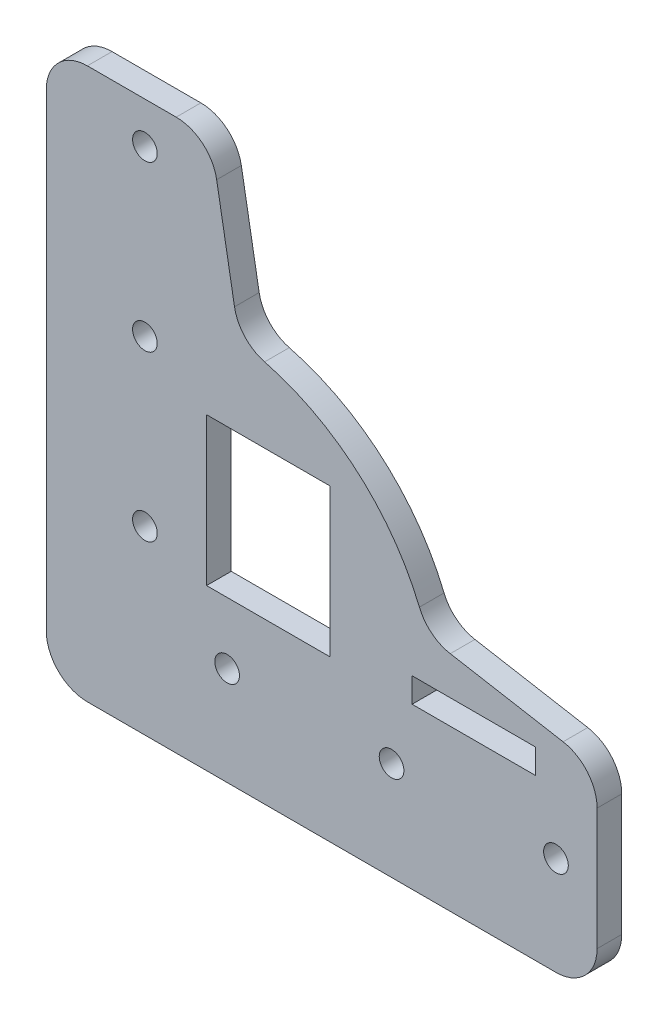
ISO-10303-21;
HEADER;
FILE_DESCRIPTION(('STEP AP214'),'2;1');
FILE_NAME('part.step','',(''),(''),'','','');
FILE_SCHEMA(('AUTOMOTIVE_DESIGN { 1 0 10303 214 1 1 1 1 }'));
ENDSEC;
DATA;
#1=APPLICATION_CONTEXT('core data for automotive mechanical design processes');
#2=APPLICATION_PROTOCOL_DEFINITION('international standard','automotive_design',2000,#1);
#3=PRODUCT_CONTEXT('',#1,'mechanical');
#4=PRODUCT('Part','Part','',(#3));
#5=PRODUCT_RELATED_PRODUCT_CATEGORY('part','',(#4));
#6=PRODUCT_DEFINITION_FORMATION('','',#4);
#7=PRODUCT_DEFINITION_CONTEXT('part definition',#1,'design');
#8=PRODUCT_DEFINITION('design','',#6,#7);
#9=PRODUCT_DEFINITION_SHAPE('','',#8);
#10=(LENGTH_UNIT() NAMED_UNIT(*) SI_UNIT(.MILLI.,.METRE.));
#11=(NAMED_UNIT(*) PLANE_ANGLE_UNIT() SI_UNIT($,.RADIAN.));
#12=(NAMED_UNIT(*) SI_UNIT($,.STERADIAN.) SOLID_ANGLE_UNIT());
#13=UNCERTAINTY_MEASURE_WITH_UNIT(LENGTH_MEASURE(1.E-05),#10,'distance_accuracy_value','');
#14=(GEOMETRIC_REPRESENTATION_CONTEXT(3) GLOBAL_UNCERTAINTY_ASSIGNED_CONTEXT((#13)) GLOBAL_UNIT_ASSIGNED_CONTEXT((#10,
#11,#12)) REPRESENTATION_CONTEXT('',''));
#15=CARTESIAN_POINT('',(0.,0.,0.));
#16=DIRECTION('',(0.,0.,1.));
#17=DIRECTION('',(1.,0.,0.));
#18=AXIS2_PLACEMENT_3D('',#15,#16,#17);
#19=CARTESIAN_POINT('',(27.8219353715967,51.4334525485574,3.));
#20=DIRECTION('',(0.,0.,1.));
#21=DIRECTION('',(1.,0.,0.));
#22=AXIS2_PLACEMENT_3D('',#19,#20,#21);
#23=PLANE('',#22);
#24=CARTESIAN_POINT('',(42.,12.,3.));
#25=DIRECTION('',(0.,0.,1.));
#26=DIRECTION('',(-1.,0.,0.));
#27=AXIS2_PLACEMENT_3D('',#24,#25,#26);
#28=CIRCLE('',#27,1.5);
#29=CARTESIAN_POINT('',(40.5,12.,3.));
#30=VERTEX_POINT('',#29);
#31=EDGE_CURVE('E231',#30,#30,#28,.T.);
#32=ORIENTED_EDGE('',*,*,#31,.F.);
#33=EDGE_LOOP('',(#32));
#34=FACE_BOUND('',#33,.T.);
#35=DIRECTION('',(1.,0.,0.));
#36=VECTOR('',#35,1.);
#37=CARTESIAN_POINT('',(19.5,19.5,3.));
#38=LINE('',#37,#36);
#39=CARTESIAN_POINT('',(19.5,19.5,3.));
#40=VERTEX_POINT('',#39);
#41=CARTESIAN_POINT('',(34.5,19.5,3.));
#42=VERTEX_POINT('',#41);
#43=EDGE_CURVE('E245',#40,#42,#38,.T.);
#44=ORIENTED_EDGE('',*,*,#43,.F.);
#45=DIRECTION('',(0.,-1.,0.));
#46=VECTOR('',#45,1.);
#47=CARTESIAN_POINT('',(19.5,37.5,3.));
#48=LINE('',#47,#46);
#49=CARTESIAN_POINT('',(19.5,37.5,3.));
#50=VERTEX_POINT('',#49);
#51=EDGE_CURVE('E243',#50,#40,#48,.T.);
#52=ORIENTED_EDGE('',*,*,#51,.F.);
#53=DIRECTION('',(-1.,0.,0.));
#54=VECTOR('',#53,1.);
#55=CARTESIAN_POINT('',(19.5,37.5,3.));
#56=LINE('',#55,#54);
#57=CARTESIAN_POINT('',(34.5,37.5,3.));
#58=VERTEX_POINT('',#57);
#59=EDGE_CURVE('E251',#58,#50,#56,.T.);
#60=ORIENTED_EDGE('',*,*,#59,.F.);
#61=DIRECTION('',(0.,1.,0.));
#62=VECTOR('',#61,1.);
#63=CARTESIAN_POINT('',(34.5,37.5,3.));
#64=LINE('',#63,#62);
#65=EDGE_CURVE('E248',#42,#58,#64,.T.);
#66=ORIENTED_EDGE('',*,*,#65,.F.);
#67=EDGE_LOOP('',(#44,#52,#60,#66));
#68=FACE_BOUND('',#67,.T.);
#69=CARTESIAN_POINT('',(12.,22.,3.));
#70=DIRECTION('',(0.,0.,1.));
#71=DIRECTION('',(1.,0.,0.));
#72=AXIS2_PLACEMENT_3D('',#69,#70,#71);
#73=CIRCLE('',#72,1.5);
#74=CARTESIAN_POINT('',(13.5,22.,3.));
#75=VERTEX_POINT('',#74);
#76=EDGE_CURVE('E274',#75,#75,#73,.T.);
#77=ORIENTED_EDGE('',*,*,#76,.F.);
#78=EDGE_LOOP('',(#77));
#79=FACE_BOUND('',#78,.T.);
#80=CARTESIAN_POINT('',(12.,42.,3.));
#81=DIRECTION('',(0.,0.,1.));
#82=DIRECTION('',(1.,0.,0.));
#83=AXIS2_PLACEMENT_3D('',#80,#81,#82);
#84=CIRCLE('',#83,1.5);
#85=CARTESIAN_POINT('',(13.5,42.,3.));
#86=VERTEX_POINT('',#85);
#87=EDGE_CURVE('E286',#86,#86,#84,.T.);
#88=ORIENTED_EDGE('',*,*,#87,.F.);
#89=EDGE_LOOP('',(#88));
#90=FACE_BOUND('',#89,.T.);
#91=DIRECTION('',(0.,-1.,0.));
#92=VECTOR('',#91,1.);
#93=CARTESIAN_POINT('',(0.,0.,3.));
#94=LINE('',#93,#92);
#95=CARTESIAN_POINT('',(0.,62.,3.));
#96=VERTEX_POINT('',#95);
#97=CARTESIAN_POINT('',(0.,5.,3.));
#98=VERTEX_POINT('',#97);
#99=EDGE_CURVE('E311',#96,#98,#94,.T.);
#100=ORIENTED_EDGE('',*,*,#99,.T.);
#101=CARTESIAN_POINT('',(5.,5.,3.));
#102=DIRECTION('',(0.,0.,1.));
#103=DIRECTION('',(1.,0.,0.));
#104=AXIS2_PLACEMENT_3D('',#101,#102,#103);
#105=CIRCLE('',#104,5.);
#106=CARTESIAN_POINT('',(5.,0.,3.));
#107=VERTEX_POINT('',#106);
#108=EDGE_CURVE('E373',#98,#107,#105,.T.);
#109=ORIENTED_EDGE('',*,*,#108,.T.);
#110=DIRECTION('',(1.,0.,0.));
#111=VECTOR('',#110,1.);
#112=CARTESIAN_POINT('',(67.,0.,3.));
#113=LINE('',#112,#111);
#114=CARTESIAN_POINT('',(62.,0.,3.));
#115=VERTEX_POINT('',#114);
#116=EDGE_CURVE('E292',#107,#115,#113,.T.);
#117=ORIENTED_EDGE('',*,*,#116,.T.);
#118=CARTESIAN_POINT('',(62.,5.,3.));
#119=DIRECTION('',(0.,0.,1.));
#120=DIRECTION('',(1.,0.,0.));
#121=AXIS2_PLACEMENT_3D('',#118,#119,#120);
#122=CIRCLE('',#121,5.);
#123=CARTESIAN_POINT('',(67.,5.,3.));
#124=VERTEX_POINT('',#123);
#125=EDGE_CURVE('E371',#115,#124,#122,.T.);
#126=ORIENTED_EDGE('',*,*,#125,.T.);
#127=DIRECTION('',(0.,1.,0.));
#128=VECTOR('',#127,1.);
#129=CARTESIAN_POINT('',(67.,24.,3.));
#130=LINE('',#129,#128);
#131=CARTESIAN_POINT('',(67.,19.8045018441136,3.));
#132=VERTEX_POINT('',#131);
#133=EDGE_CURVE('E295',#124,#132,#130,.T.);
#134=ORIENTED_EDGE('',*,*,#133,.T.);
#135=CARTESIAN_POINT('',(62.,19.8045018441136,3.));
#136=DIRECTION('',(0.,0.,1.));
#137=DIRECTION('',(1.,0.,0.));
#138=AXIS2_PLACEMENT_3D('',#135,#136,#137);
#139=CIRCLE('',#138,5.);
#140=CARTESIAN_POINT('',(62.8682408883347,24.7285406091746,3.));
#141=VERTEX_POINT('',#140);
#142=EDGE_CURVE('E369',#132,#141,#139,.T.);
#143=ORIENTED_EDGE('',*,*,#142,.T.);
#144=DIRECTION('',(-0.984807753012208,0.173648177666931,0.));
#145=VECTOR('',#144,1.);
#146=CARTESIAN_POINT('',(49.1428436302579,27.1486984667156,3.));
#147=LINE('',#146,#145);
#148=CARTESIAN_POINT('',(49.1428436302579,27.1486984667156,3.));
#149=VERTEX_POINT('',#148);
#150=EDGE_CURVE('E299',#141,#149,#147,.T.);
#151=ORIENTED_EDGE('',*,*,#150,.T.);
#152=CARTESIAN_POINT('',(50.0110845185925,32.0727372317766,3.));
#153=DIRECTION('',(0.,0.,-1.));
#154=DIRECTION('',(1.,0.,0.));
#155=AXIS2_PLACEMENT_3D('',#152,#153,#154);
#156=CIRCLE('',#155,5.);
#157=CARTESIAN_POINT('',(45.3881929248664,30.1677770451438,3.));
#158=VERTEX_POINT('',#157);
#159=EDGE_CURVE('E301',#149,#158,#156,.T.);
#160=ORIENTED_EDGE('',*,*,#159,.T.);
#161=CARTESIAN_POINT('',(19.5,19.5,3.));
#162=DIRECTION('',(0.,0.,1.));
#163=DIRECTION('',(-1.,0.,0.));
#164=AXIS2_PLACEMENT_3D('',#161,#162,#163);
#165=CIRCLE('',#164,28.);
#166=CARTESIAN_POINT('',(26.5610360728699,46.5950506472608,3.));
#167=VERTEX_POINT('',#166);
#168=EDGE_CURVE('E303',#158,#167,#165,.T.);
#169=ORIENTED_EDGE('',*,*,#168,.T.);
#170=CARTESIAN_POINT('',(27.8219353715967,51.4334525485574,3.));
#171=DIRECTION('',(0.,0.,-1.));
#172=DIRECTION('',(1.,0.,0.));
#173=AXIS2_PLACEMENT_3D('',#170,#171,#172);
#174=CIRCLE('',#173,5.);
#175=CARTESIAN_POINT('',(22.8978966065356,50.5652116602228,3.));
#176=VERTEX_POINT('',#175);
#177=EDGE_CURVE('E305',#167,#176,#174,.T.);
#178=ORIENTED_EDGE('',*,*,#177,.T.);
#179=DIRECTION('',(-0.173648177666932,0.984807753012208,0.));
#180=VECTOR('',#179,1.);
#181=CARTESIAN_POINT('',(20.,67.,3.));
#182=LINE('',#181,#180);
#183=CARTESIAN_POINT('',(20.7285406091746,62.8682408883347,3.));
#184=VERTEX_POINT('',#183);
#185=EDGE_CURVE('E307',#176,#184,#182,.T.);
#186=ORIENTED_EDGE('',*,*,#185,.T.);
#187=CARTESIAN_POINT('',(15.8045018441136,62.,3.));
#188=DIRECTION('',(0.,0.,1.));
#189=DIRECTION('',(1.,0.,0.));
#190=AXIS2_PLACEMENT_3D('',#187,#188,#189);
#191=CIRCLE('',#190,5.);
#192=CARTESIAN_POINT('',(15.8045018441136,67.,3.));
#193=VERTEX_POINT('',#192);
#194=EDGE_CURVE('E55',#184,#193,#191,.T.);
#195=ORIENTED_EDGE('',*,*,#194,.T.);
#196=DIRECTION('',(-1.,0.,0.));
#197=VECTOR('',#196,1.);
#198=CARTESIAN_POINT('',(0.,67.,3.));
#199=LINE('',#198,#197);
#200=CARTESIAN_POINT('',(5.,67.,3.));
#201=VERTEX_POINT('',#200);
#202=EDGE_CURVE('E309',#193,#201,#199,.T.);
#203=ORIENTED_EDGE('',*,*,#202,.T.);
#204=CARTESIAN_POINT('',(5.,62.,3.));
#205=DIRECTION('',(0.,0.,1.));
#206=DIRECTION('',(1.,0.,0.));
#207=AXIS2_PLACEMENT_3D('',#204,#205,#206);
#208=CIRCLE('',#207,5.);
#209=EDGE_CURVE('E367',#201,#96,#208,.T.);
#210=ORIENTED_EDGE('',*,*,#209,.T.);
#211=EDGE_LOOP('',(#100,#109,#117,#126,#134,#143,#151,#160,#169,#178,#186,#195,#203,#210));
#212=FACE_BOUND('',#211,.T.);
#213=CARTESIAN_POINT('',(12.,62.,3.));
#214=DIRECTION('',(0.,0.,1.));
#215=DIRECTION('',(1.,0.,0.));
#216=AXIS2_PLACEMENT_3D('',#213,#214,#215);
#217=CIRCLE('',#216,1.5);
#218=CARTESIAN_POINT('',(13.5,62.,3.));
#219=VERTEX_POINT('',#218);
#220=EDGE_CURVE('E280',#219,#219,#217,.T.);
#221=ORIENTED_EDGE('',*,*,#220,.F.);
#222=EDGE_LOOP('',(#221));
#223=FACE_BOUND('',#222,.T.);
#224=CARTESIAN_POINT('',(62.,12.,3.));
#225=DIRECTION('',(0.,0.,1.));
#226=DIRECTION('',(-1.,0.,0.));
#227=AXIS2_PLACEMENT_3D('',#224,#225,#226);
#228=CIRCLE('',#227,1.5);
#229=CARTESIAN_POINT('',(60.5,12.,3.));
#230=VERTEX_POINT('',#229);
#231=EDGE_CURVE('E237',#230,#230,#228,.T.);
#232=ORIENTED_EDGE('',*,*,#231,.F.);
#233=EDGE_LOOP('',(#232));
#234=FACE_BOUND('',#233,.T.);
#235=CARTESIAN_POINT('',(22.,12.,3.));
#236=DIRECTION('',(0.,0.,1.));
#237=DIRECTION('',(-1.,0.,0.));
#238=AXIS2_PLACEMENT_3D('',#235,#236,#237);
#239=CIRCLE('',#238,1.5);
#240=CARTESIAN_POINT('',(20.5,12.,3.));
#241=VERTEX_POINT('',#240);
#242=EDGE_CURVE('E225',#241,#241,#239,.T.);
#243=ORIENTED_EDGE('',*,*,#242,.F.);
#244=EDGE_LOOP('',(#243));
#245=FACE_BOUND('',#244,.T.);
#246=DIRECTION('',(1.,0.,0.));
#247=VECTOR('',#246,1.);
#248=CARTESIAN_POINT('',(44.5,19.5,3.));
#249=LINE('',#248,#247);
#250=CARTESIAN_POINT('',(44.5,19.5,3.));
#251=VERTEX_POINT('',#250);
#252=CARTESIAN_POINT('',(59.5,19.5,3.));
#253=VERTEX_POINT('',#252);
#254=EDGE_CURVE('E194',#251,#253,#249,.T.);
#255=ORIENTED_EDGE('',*,*,#254,.F.);
#256=DIRECTION('',(0.,-1.,0.));
#257=VECTOR('',#256,1.);
#258=CARTESIAN_POINT('',(44.5,19.5,3.));
#259=LINE('',#258,#257);
#260=CARTESIAN_POINT('',(44.5,22.5,3.));
#261=VERTEX_POINT('',#260);
#262=EDGE_CURVE('E184',#261,#251,#259,.T.);
#263=ORIENTED_EDGE('',*,*,#262,.F.);
#264=DIRECTION('',(-1.,0.,0.));
#265=VECTOR('',#264,1.);
#266=CARTESIAN_POINT('',(44.5,22.5,3.));
#267=LINE('',#266,#265);
#268=CARTESIAN_POINT('',(59.5,22.5,3.));
#269=VERTEX_POINT('',#268);
#270=EDGE_CURVE('E209',#269,#261,#267,.T.);
#271=ORIENTED_EDGE('',*,*,#270,.F.);
#272=DIRECTION('',(0.,1.,0.));
#273=VECTOR('',#272,1.);
#274=CARTESIAN_POINT('',(59.5,19.5,3.));
#275=LINE('',#274,#273);
#276=EDGE_CURVE('E207',#253,#269,#275,.T.);
#277=ORIENTED_EDGE('',*,*,#276,.F.);
#278=EDGE_LOOP('',(#255,#263,#271,#277));
#279=FACE_BOUND('',#278,.T.);
#280=ADVANCED_FACE('F34',(#34,#68,#79,#90,#212,#223,#234,#245,#279),#23,.T.);
#281=CARTESIAN_POINT('',(27.8219353715967,51.4334525485574,0.));
#282=DIRECTION('',(0.,0.,1.));
#283=DIRECTION('',(1.,0.,0.));
#284=AXIS2_PLACEMENT_3D('',#281,#282,#283);
#285=PLANE('',#284);
#286=CARTESIAN_POINT('',(22.,12.,0.));
#287=DIRECTION('',(0.,0.,1.));
#288=DIRECTION('',(-1.,0.,0.));
#289=AXIS2_PLACEMENT_3D('',#286,#287,#288);
#290=CIRCLE('',#289,1.5);
#291=CARTESIAN_POINT('',(20.5,12.,0.));
#292=VERTEX_POINT('',#291);
#293=EDGE_CURVE('E202',#292,#292,#290,.T.);
#294=ORIENTED_EDGE('',*,*,#293,.T.);
#295=EDGE_LOOP('',(#294));
#296=FACE_BOUND('',#295,.T.);
#297=CARTESIAN_POINT('',(42.,12.,0.));
#298=DIRECTION('',(0.,0.,1.));
#299=DIRECTION('',(-1.,0.,0.));
#300=AXIS2_PLACEMENT_3D('',#297,#298,#299);
#301=CIRCLE('',#300,1.5);
#302=CARTESIAN_POINT('',(40.5,12.,0.));
#303=VERTEX_POINT('',#302);
#304=EDGE_CURVE('E228',#303,#303,#301,.T.);
#305=ORIENTED_EDGE('',*,*,#304,.T.);
#306=EDGE_LOOP('',(#305));
#307=FACE_BOUND('',#306,.T.);
#308=CARTESIAN_POINT('',(62.,12.,0.));
#309=DIRECTION('',(0.,0.,1.));
#310=DIRECTION('',(-1.,0.,0.));
#311=AXIS2_PLACEMENT_3D('',#308,#309,#310);
#312=CIRCLE('',#311,1.5);
#313=CARTESIAN_POINT('',(60.5,12.,0.));
#314=VERTEX_POINT('',#313);
#315=EDGE_CURVE('E234',#314,#314,#312,.T.);
#316=ORIENTED_EDGE('',*,*,#315,.T.);
#317=EDGE_LOOP('',(#316));
#318=FACE_BOUND('',#317,.T.);
#319=DIRECTION('',(0.,-1.,0.));
#320=VECTOR('',#319,1.);
#321=CARTESIAN_POINT('',(19.5,37.5,0.));
#322=LINE('',#321,#320);
#323=CARTESIAN_POINT('',(19.5,37.5,0.));
#324=VERTEX_POINT('',#323);
#325=CARTESIAN_POINT('',(19.5,19.5,0.));
#326=VERTEX_POINT('',#325);
#327=EDGE_CURVE('E240',#324,#326,#322,.T.);
#328=ORIENTED_EDGE('',*,*,#327,.T.);
#329=DIRECTION('',(1.,0.,0.));
#330=VECTOR('',#329,1.);
#331=CARTESIAN_POINT('',(19.5,19.5,0.));
#332=LINE('',#331,#330);
#333=CARTESIAN_POINT('',(34.5,19.5,0.));
#334=VERTEX_POINT('',#333);
#335=EDGE_CURVE('E256',#326,#334,#332,.T.);
#336=ORIENTED_EDGE('',*,*,#335,.T.);
#337=DIRECTION('',(0.,1.,0.));
#338=VECTOR('',#337,1.);
#339=CARTESIAN_POINT('',(34.5,37.5,0.));
#340=LINE('',#339,#338);
#341=CARTESIAN_POINT('',(34.5,37.5,0.));
#342=VERTEX_POINT('',#341);
#343=EDGE_CURVE('E259',#334,#342,#340,.T.);
#344=ORIENTED_EDGE('',*,*,#343,.T.);
#345=DIRECTION('',(-1.,0.,0.));
#346=VECTOR('',#345,1.);
#347=CARTESIAN_POINT('',(19.5,37.5,0.));
#348=LINE('',#347,#346);
#349=EDGE_CURVE('E246',#342,#324,#348,.T.);
#350=ORIENTED_EDGE('',*,*,#349,.T.);
#351=EDGE_LOOP('',(#328,#336,#344,#350));
#352=FACE_BOUND('',#351,.T.);
#353=DIRECTION('',(1.,0.,0.));
#354=VECTOR('',#353,1.);
#355=CARTESIAN_POINT('',(67.,0.,0.));
#356=LINE('',#355,#354);
#357=CARTESIAN_POINT('',(5.,0.,0.));
#358=VERTEX_POINT('',#357);
#359=CARTESIAN_POINT('',(62.,0.,0.));
#360=VERTEX_POINT('',#359);
#361=EDGE_CURVE('E289',#358,#360,#356,.T.);
#362=ORIENTED_EDGE('',*,*,#361,.F.);
#363=CARTESIAN_POINT('',(5.,5.,0.));
#364=DIRECTION('',(0.,0.,1.));
#365=DIRECTION('',(1.,0.,0.));
#366=AXIS2_PLACEMENT_3D('',#363,#364,#365);
#367=CIRCLE('',#366,5.);
#368=CARTESIAN_POINT('',(0.,5.,0.));
#369=VERTEX_POINT('',#368);
#370=EDGE_CURVE('E359',#358,#369,#367,.F.);
#371=ORIENTED_EDGE('',*,*,#370,.T.);
#372=DIRECTION('',(0.,-1.,0.));
#373=VECTOR('',#372,1.);
#374=CARTESIAN_POINT('',(0.,0.,0.));
#375=LINE('',#374,#373);
#376=CARTESIAN_POINT('',(0.,62.,0.));
#377=VERTEX_POINT('',#376);
#378=EDGE_CURVE('E296',#377,#369,#375,.T.);
#379=ORIENTED_EDGE('',*,*,#378,.F.);
#380=CARTESIAN_POINT('',(5.,62.,0.));
#381=DIRECTION('',(0.,0.,1.));
#382=DIRECTION('',(1.,0.,0.));
#383=AXIS2_PLACEMENT_3D('',#380,#381,#382);
#384=CIRCLE('',#383,5.);
#385=CARTESIAN_POINT('',(5.,67.,0.));
#386=VERTEX_POINT('',#385);
#387=EDGE_CURVE('E353',#377,#386,#384,.F.);
#388=ORIENTED_EDGE('',*,*,#387,.T.);
#389=DIRECTION('',(-1.,0.,0.));
#390=VECTOR('',#389,1.);
#391=CARTESIAN_POINT('',(0.,67.,0.));
#392=LINE('',#391,#390);
#393=CARTESIAN_POINT('',(15.8045018441136,67.,0.));
#394=VERTEX_POINT('',#393);
#395=EDGE_CURVE('E331',#394,#386,#392,.T.);
#396=ORIENTED_EDGE('',*,*,#395,.F.);
#397=CARTESIAN_POINT('',(15.8045018441136,62.,0.));
#398=DIRECTION('',(0.,0.,1.));
#399=DIRECTION('',(1.,0.,0.));
#400=AXIS2_PLACEMENT_3D('',#397,#398,#399);
#401=CIRCLE('',#400,5.);
#402=CARTESIAN_POINT('',(20.7285406091746,62.8682408883347,0.));
#403=VERTEX_POINT('',#402);
#404=EDGE_CURVE('E351',#394,#403,#401,.F.);
#405=ORIENTED_EDGE('',*,*,#404,.T.);
#406=DIRECTION('',(-0.173648177666932,0.984807753012208,0.));
#407=VECTOR('',#406,1.);
#408=CARTESIAN_POINT('',(20.,67.,0.));
#409=LINE('',#408,#407);
#410=CARTESIAN_POINT('',(22.8978966065356,50.5652116602228,0.));
#411=VERTEX_POINT('',#410);
#412=EDGE_CURVE('E328',#411,#403,#409,.T.);
#413=ORIENTED_EDGE('',*,*,#412,.F.);
#414=CARTESIAN_POINT('',(27.8219353715967,51.4334525485574,0.));
#415=DIRECTION('',(0.,0.,-1.));
#416=DIRECTION('',(1.,0.,0.));
#417=AXIS2_PLACEMENT_3D('',#414,#415,#416);
#418=CIRCLE('',#417,5.);
#419=CARTESIAN_POINT('',(26.5610360728699,46.5950506472608,0.));
#420=VERTEX_POINT('',#419);
#421=EDGE_CURVE('E326',#420,#411,#418,.T.);
#422=ORIENTED_EDGE('',*,*,#421,.F.);
#423=CARTESIAN_POINT('',(19.5,19.5,0.));
#424=DIRECTION('',(0.,0.,1.));
#425=DIRECTION('',(-1.,0.,0.));
#426=AXIS2_PLACEMENT_3D('',#423,#424,#425);
#427=CIRCLE('',#426,28.);
#428=CARTESIAN_POINT('',(45.3881929248664,30.1677770451438,0.));
#429=VERTEX_POINT('',#428);
#430=EDGE_CURVE('E324',#429,#420,#427,.T.);
#431=ORIENTED_EDGE('',*,*,#430,.F.);
#432=CARTESIAN_POINT('',(50.0110845185925,32.0727372317766,0.));
#433=DIRECTION('',(0.,0.,-1.));
#434=DIRECTION('',(1.,0.,0.));
#435=AXIS2_PLACEMENT_3D('',#432,#433,#434);
#436=CIRCLE('',#435,5.);
#437=CARTESIAN_POINT('',(49.1428436302579,27.1486984667156,0.));
#438=VERTEX_POINT('',#437);
#439=EDGE_CURVE('E322',#438,#429,#436,.T.);
#440=ORIENTED_EDGE('',*,*,#439,.F.);
#441=DIRECTION('',(-0.984807753012208,0.173648177666931,0.));
#442=VECTOR('',#441,1.);
#443=CARTESIAN_POINT('',(49.1428436302579,27.1486984667156,0.));
#444=LINE('',#443,#442);
#445=CARTESIAN_POINT('',(62.8682408883347,24.7285406091746,0.));
#446=VERTEX_POINT('',#445);
#447=EDGE_CURVE('E320',#446,#438,#444,.T.);
#448=ORIENTED_EDGE('',*,*,#447,.F.);
#449=CARTESIAN_POINT('',(62.,19.8045018441136,0.));
#450=DIRECTION('',(0.,0.,1.));
#451=DIRECTION('',(1.,0.,0.));
#452=AXIS2_PLACEMENT_3D('',#449,#450,#451);
#453=CIRCLE('',#452,5.);
#454=CARTESIAN_POINT('',(67.,19.8045018441136,0.));
#455=VERTEX_POINT('',#454);
#456=EDGE_CURVE('E355',#446,#455,#453,.F.);
#457=ORIENTED_EDGE('',*,*,#456,.T.);
#458=DIRECTION('',(0.,1.,0.));
#459=VECTOR('',#458,1.);
#460=CARTESIAN_POINT('',(67.,24.,0.));
#461=LINE('',#460,#459);
#462=CARTESIAN_POINT('',(67.,5.,0.));
#463=VERTEX_POINT('',#462);
#464=EDGE_CURVE('E317',#463,#455,#461,.T.);
#465=ORIENTED_EDGE('',*,*,#464,.F.);
#466=CARTESIAN_POINT('',(62.,5.,0.));
#467=DIRECTION('',(0.,0.,1.));
#468=DIRECTION('',(1.,0.,0.));
#469=AXIS2_PLACEMENT_3D('',#466,#467,#468);
#470=CIRCLE('',#469,5.);
#471=EDGE_CURVE('E357',#463,#360,#470,.F.);
#472=ORIENTED_EDGE('',*,*,#471,.T.);
#473=EDGE_LOOP('',(#362,#371,#379,#388,#396,#405,#413,#422,#431,#440,#448,#457,#465,#472));
#474=FACE_BOUND('',#473,.T.);
#475=CARTESIAN_POINT('',(12.,42.,0.));
#476=DIRECTION('',(0.,0.,1.));
#477=DIRECTION('',(1.,0.,0.));
#478=AXIS2_PLACEMENT_3D('',#475,#476,#477);
#479=CIRCLE('',#478,1.5);
#480=CARTESIAN_POINT('',(13.5,42.,0.));
#481=VERTEX_POINT('',#480);
#482=EDGE_CURVE('E283',#481,#481,#479,.T.);
#483=ORIENTED_EDGE('',*,*,#482,.T.);
#484=EDGE_LOOP('',(#483));
#485=FACE_BOUND('',#484,.T.);
#486=CARTESIAN_POINT('',(12.,62.,0.));
#487=DIRECTION('',(0.,0.,1.));
#488=DIRECTION('',(1.,0.,0.));
#489=AXIS2_PLACEMENT_3D('',#486,#487,#488);
#490=CIRCLE('',#489,1.5);
#491=CARTESIAN_POINT('',(13.5,62.,0.));
#492=VERTEX_POINT('',#491);
#493=EDGE_CURVE('E277',#492,#492,#490,.T.);
#494=ORIENTED_EDGE('',*,*,#493,.T.);
#495=EDGE_LOOP('',(#494));
#496=FACE_BOUND('',#495,.T.);
#497=CARTESIAN_POINT('',(12.,22.,0.));
#498=DIRECTION('',(0.,0.,1.));
#499=DIRECTION('',(1.,0.,0.));
#500=AXIS2_PLACEMENT_3D('',#497,#498,#499);
#501=CIRCLE('',#500,1.5);
#502=CARTESIAN_POINT('',(13.5,22.,0.));
#503=VERTEX_POINT('',#502);
#504=EDGE_CURVE('E273',#503,#503,#501,.T.);
#505=ORIENTED_EDGE('',*,*,#504,.T.);
#506=EDGE_LOOP('',(#505));
#507=FACE_BOUND('',#506,.T.);
#508=DIRECTION('',(0.,-1.,0.));
#509=VECTOR('',#508,1.);
#510=CARTESIAN_POINT('',(44.5,19.5,0.));
#511=LINE('',#510,#509);
#512=CARTESIAN_POINT('',(44.5,22.5,0.));
#513=VERTEX_POINT('',#512);
#514=CARTESIAN_POINT('',(44.5,19.5,0.));
#515=VERTEX_POINT('',#514);
#516=EDGE_CURVE('E213',#513,#515,#511,.T.);
#517=ORIENTED_EDGE('',*,*,#516,.T.);
#518=DIRECTION('',(1.,0.,0.));
#519=VECTOR('',#518,1.);
#520=CARTESIAN_POINT('',(44.5,19.5,0.));
#521=LINE('',#520,#519);
#522=CARTESIAN_POINT('',(59.5,19.5,0.));
#523=VERTEX_POINT('',#522);
#524=EDGE_CURVE('E201',#515,#523,#521,.T.);
#525=ORIENTED_EDGE('',*,*,#524,.T.);
#526=DIRECTION('',(0.,1.,0.));
#527=VECTOR('',#526,1.);
#528=CARTESIAN_POINT('',(59.5,19.5,0.));
#529=LINE('',#528,#527);
#530=CARTESIAN_POINT('',(59.5,22.5,0.));
#531=VERTEX_POINT('',#530);
#532=EDGE_CURVE('E216',#523,#531,#529,.T.);
#533=ORIENTED_EDGE('',*,*,#532,.T.);
#534=DIRECTION('',(-1.,0.,0.));
#535=VECTOR('',#534,1.);
#536=CARTESIAN_POINT('',(44.5,22.5,0.));
#537=LINE('',#536,#535);
#538=EDGE_CURVE('E195',#531,#513,#537,.T.);
#539=ORIENTED_EDGE('',*,*,#538,.T.);
#540=EDGE_LOOP('',(#517,#525,#533,#539));
#541=FACE_BOUND('',#540,.T.);
#542=ADVANCED_FACE('F391',(#296,#307,#318,#352,#474,#485,#496,#507,#541),#285,.F.);
#543=CARTESIAN_POINT('',(67.,0.,3.));
#544=DIRECTION('',(0.,1.,0.));
#545=DIRECTION('',(-1.,0.,0.));
#546=AXIS2_PLACEMENT_3D('',#543,#544,#545);
#547=PLANE('',#546);
#548=ORIENTED_EDGE('',*,*,#116,.F.);
#549=DIRECTION('',(0.,0.,-1.));
#550=VECTOR('',#549,1.);
#551=CARTESIAN_POINT('',(5.,0.,3.));
#552=LINE('',#551,#550);
#553=EDGE_CURVE('E348',#107,#358,#552,.T.);
#554=ORIENTED_EDGE('',*,*,#553,.T.);
#555=ORIENTED_EDGE('',*,*,#361,.T.);
#556=DIRECTION('',(0.,0.,-1.));
#557=VECTOR('',#556,1.);
#558=CARTESIAN_POINT('',(62.,0.,3.));
#559=LINE('',#558,#557);
#560=EDGE_CURVE('E346',#360,#115,#559,.F.);
#561=ORIENTED_EDGE('',*,*,#560,.T.);
#562=EDGE_LOOP('',(#548,#554,#555,#561));
#563=FACE_BOUND('',#562,.T.);
#564=ADVANCED_FACE('F410',(#563),#547,.F.);
#565=CARTESIAN_POINT('',(67.,24.,3.));
#566=DIRECTION('',(-1.,0.,0.));
#567=DIRECTION('',(0.,0.,1.));
#568=AXIS2_PLACEMENT_3D('',#565,#566,#567);
#569=PLANE('',#568);
#570=ORIENTED_EDGE('',*,*,#133,.F.);
#571=DIRECTION('',(0.,0.,-1.));
#572=VECTOR('',#571,1.);
#573=CARTESIAN_POINT('',(67.,5.,3.));
#574=LINE('',#573,#572);
#575=EDGE_CURVE('E377',#124,#463,#574,.T.);
#576=ORIENTED_EDGE('',*,*,#575,.T.);
#577=ORIENTED_EDGE('',*,*,#464,.T.);
#578=DIRECTION('',(0.,0.,-1.));
#579=VECTOR('',#578,1.);
#580=CARTESIAN_POINT('',(67.,19.8045018441136,3.));
#581=LINE('',#580,#579);
#582=EDGE_CURVE('E375',#455,#132,#581,.F.);
#583=ORIENTED_EDGE('',*,*,#582,.T.);
#584=EDGE_LOOP('',(#570,#576,#577,#583));
#585=FACE_BOUND('',#584,.T.);
#586=ADVANCED_FACE('F419',(#585),#569,.F.);
#587=CARTESIAN_POINT('',(49.1428436302579,27.1486984667156,3.));
#588=DIRECTION('',(-0.173648177666931,-0.984807753012208,0.));
#589=DIRECTION('',(0.984807753012208,-0.173648177666931,0.));
#590=AXIS2_PLACEMENT_3D('',#587,#588,#589);
#591=PLANE('',#590);
#592=ORIENTED_EDGE('',*,*,#150,.F.);
#593=DIRECTION('',(0.,0.,-1.));
#594=VECTOR('',#593,1.);
#595=CARTESIAN_POINT('',(62.8682408883347,24.7285406091746,3.));
#596=LINE('',#595,#594);
#597=EDGE_CURVE('E380',#141,#446,#596,.T.);
#598=ORIENTED_EDGE('',*,*,#597,.T.);
#599=ORIENTED_EDGE('',*,*,#447,.T.);
#600=DIRECTION('',(0.,0.,-1.));
#601=VECTOR('',#600,1.);
#602=CARTESIAN_POINT('',(49.1428436302579,27.1486984667156,3.));
#603=LINE('',#602,#601);
#604=EDGE_CURVE('E343',#149,#438,#603,.T.);
#605=ORIENTED_EDGE('',*,*,#604,.F.);
#606=EDGE_LOOP('',(#592,#598,#599,#605));
#607=FACE_BOUND('',#606,.T.);
#608=ADVANCED_FACE('F428',(#607),#591,.F.);
#609=CARTESIAN_POINT('',(50.0110845185925,32.0727372317766,3.));
#610=DIRECTION('',(0.,0.,-1.));
#611=DIRECTION('',(-1.,0.,0.));
#612=AXIS2_PLACEMENT_3D('',#609,#610,#611);
#613=CYLINDRICAL_SURFACE('',#612,5.);
#614=ORIENTED_EDGE('',*,*,#439,.T.);
#615=DIRECTION('',(0.,0.,-1.));
#616=VECTOR('',#615,1.);
#617=CARTESIAN_POINT('',(45.3881929248664,30.1677770451438,3.));
#618=LINE('',#617,#616);
#619=EDGE_CURVE('E340',#158,#429,#618,.T.);
#620=ORIENTED_EDGE('',*,*,#619,.F.);
#621=ORIENTED_EDGE('',*,*,#159,.F.);
#622=ORIENTED_EDGE('',*,*,#604,.T.);
#623=EDGE_LOOP('',(#614,#620,#621,#622));
#624=FACE_BOUND('',#623,.T.);
#625=ADVANCED_FACE('F435',(#624),#613,.F.);
#626=CARTESIAN_POINT('',(19.5,19.5,3.));
#627=DIRECTION('',(0.,0.,-1.));
#628=DIRECTION('',(-1.,0.,0.));
#629=AXIS2_PLACEMENT_3D('',#626,#627,#628);
#630=CYLINDRICAL_SURFACE('',#629,28.);
#631=ORIENTED_EDGE('',*,*,#430,.T.);
#632=DIRECTION('',(0.,0.,-1.));
#633=VECTOR('',#632,1.);
#634=CARTESIAN_POINT('',(26.5610360728699,46.5950506472608,3.));
#635=LINE('',#634,#633);
#636=EDGE_CURVE('E337',#167,#420,#635,.T.);
#637=ORIENTED_EDGE('',*,*,#636,.F.);
#638=ORIENTED_EDGE('',*,*,#168,.F.);
#639=ORIENTED_EDGE('',*,*,#619,.T.);
#640=EDGE_LOOP('',(#631,#637,#638,#639));
#641=FACE_BOUND('',#640,.T.);
#642=ADVANCED_FACE('F439',(#641),#630,.T.);
#643=CARTESIAN_POINT('',(27.8219353715967,51.4334525485574,3.));
#644=DIRECTION('',(0.,0.,-1.));
#645=DIRECTION('',(-1.,0.,0.));
#646=AXIS2_PLACEMENT_3D('',#643,#644,#645);
#647=CYLINDRICAL_SURFACE('',#646,5.);
#648=ORIENTED_EDGE('',*,*,#421,.T.);
#649=DIRECTION('',(0.,0.,-1.));
#650=VECTOR('',#649,1.);
#651=CARTESIAN_POINT('',(22.8978966065356,50.5652116602228,3.));
#652=LINE('',#651,#650);
#653=EDGE_CURVE('E314',#176,#411,#652,.T.);
#654=ORIENTED_EDGE('',*,*,#653,.F.);
#655=ORIENTED_EDGE('',*,*,#177,.F.);
#656=ORIENTED_EDGE('',*,*,#636,.T.);
#657=EDGE_LOOP('',(#648,#654,#655,#656));
#658=FACE_BOUND('',#657,.T.);
#659=ADVANCED_FACE('F445',(#658),#647,.F.);
#660=CARTESIAN_POINT('',(20.,67.,3.));
#661=DIRECTION('',(-0.984807753012208,-0.173648177666931,0.));
#662=DIRECTION('',(0.173648177666932,-0.984807753012208,0.));
#663=AXIS2_PLACEMENT_3D('',#660,#661,#662);
#664=PLANE('',#663);
#665=ORIENTED_EDGE('',*,*,#412,.T.);
#666=DIRECTION('',(0.,0.,-1.));
#667=VECTOR('',#666,1.);
#668=CARTESIAN_POINT('',(20.7285406091746,62.8682408883347,3.));
#669=LINE('',#668,#667);
#670=EDGE_CURVE('E11',#403,#184,#669,.F.);
#671=ORIENTED_EDGE('',*,*,#670,.T.);
#672=ORIENTED_EDGE('',*,*,#185,.F.);
#673=ORIENTED_EDGE('',*,*,#653,.T.);
#674=EDGE_LOOP('',(#665,#671,#672,#673));
#675=FACE_BOUND('',#674,.T.);
#676=ADVANCED_FACE('F447',(#675),#664,.F.);
#677=CARTESIAN_POINT('',(0.,67.,3.));
#678=DIRECTION('',(0.,-1.,0.));
#679=DIRECTION('',(0.,0.,-1.));
#680=AXIS2_PLACEMENT_3D('',#677,#678,#679);
#681=PLANE('',#680);
#682=ORIENTED_EDGE('',*,*,#395,.T.);
#683=DIRECTION('',(0.,0.,-1.));
#684=VECTOR('',#683,1.);
#685=CARTESIAN_POINT('',(5.,67.,3.));
#686=LINE('',#685,#684);
#687=EDGE_CURVE('E42',#386,#201,#686,.F.);
#688=ORIENTED_EDGE('',*,*,#687,.T.);
#689=ORIENTED_EDGE('',*,*,#202,.F.);
#690=DIRECTION('',(0.,0.,-1.));
#691=VECTOR('',#690,1.);
#692=CARTESIAN_POINT('',(15.8045018441136,67.,3.));
#693=LINE('',#692,#691);
#694=EDGE_CURVE('E383',#193,#394,#693,.T.);
#695=ORIENTED_EDGE('',*,*,#694,.T.);
#696=EDGE_LOOP('',(#682,#688,#689,#695));
#697=FACE_BOUND('',#696,.T.);
#698=ADVANCED_FACE('F387',(#697),#681,.F.);
#699=CARTESIAN_POINT('',(0.,0.,3.));
#700=DIRECTION('',(1.,0.,0.));
#701=DIRECTION('',(0.,0.,-1.));
#702=AXIS2_PLACEMENT_3D('',#699,#700,#701);
#703=PLANE('',#702);
#704=ORIENTED_EDGE('',*,*,#378,.T.);
#705=DIRECTION('',(0.,0.,-1.));
#706=VECTOR('',#705,1.);
#707=CARTESIAN_POINT('',(0.,5.,3.));
#708=LINE('',#707,#706);
#709=EDGE_CURVE('E364',#369,#98,#708,.F.);
#710=ORIENTED_EDGE('',*,*,#709,.T.);
#711=ORIENTED_EDGE('',*,*,#99,.F.);
#712=DIRECTION('',(0.,0.,-1.));
#713=VECTOR('',#712,1.);
#714=CARTESIAN_POINT('',(0.,62.,3.));
#715=LINE('',#714,#713);
#716=EDGE_CURVE('E361',#96,#377,#715,.T.);
#717=ORIENTED_EDGE('',*,*,#716,.T.);
#718=EDGE_LOOP('',(#704,#710,#711,#717));
#719=FACE_BOUND('',#718,.T.);
#720=ADVANCED_FACE('F401',(#719),#703,.F.);
#721=CARTESIAN_POINT('',(12.,42.,3.));
#722=DIRECTION('',(0.,0.,-1.));
#723=DIRECTION('',(-1.,0.,0.));
#724=AXIS2_PLACEMENT_3D('',#721,#722,#723);
#725=CYLINDRICAL_SURFACE('',#724,1.5);
#726=ORIENTED_EDGE('',*,*,#87,.T.);
#727=EDGE_LOOP('',(#726));
#728=FACE_BOUND('',#727,.T.);
#729=ORIENTED_EDGE('',*,*,#482,.F.);
#730=EDGE_LOOP('',(#729));
#731=FACE_BOUND('',#730,.T.);
#732=ADVANCED_FACE('F464',(#728,#731),#725,.F.);
#733=CARTESIAN_POINT('',(12.,62.,3.));
#734=DIRECTION('',(0.,0.,-1.));
#735=DIRECTION('',(-1.,0.,0.));
#736=AXIS2_PLACEMENT_3D('',#733,#734,#735);
#737=CYLINDRICAL_SURFACE('',#736,1.5);
#738=ORIENTED_EDGE('',*,*,#220,.T.);
#739=EDGE_LOOP('',(#738));
#740=FACE_BOUND('',#739,.T.);
#741=ORIENTED_EDGE('',*,*,#493,.F.);
#742=EDGE_LOOP('',(#741));
#743=FACE_BOUND('',#742,.T.);
#744=ADVANCED_FACE('F620',(#740,#743),#737,.F.);
#745=CARTESIAN_POINT('',(12.,22.,3.));
#746=DIRECTION('',(0.,0.,-1.));
#747=DIRECTION('',(-1.,0.,0.));
#748=AXIS2_PLACEMENT_3D('',#745,#746,#747);
#749=CYLINDRICAL_SURFACE('',#748,1.5);
#750=ORIENTED_EDGE('',*,*,#76,.T.);
#751=EDGE_LOOP('',(#750));
#752=FACE_BOUND('',#751,.T.);
#753=ORIENTED_EDGE('',*,*,#504,.F.);
#754=EDGE_LOOP('',(#753));
#755=FACE_BOUND('',#754,.T.);
#756=ADVANCED_FACE('F611',(#752,#755),#749,.F.);
#757=CARTESIAN_POINT('',(19.5,37.5,3.));
#758=DIRECTION('',(1.,0.,0.));
#759=DIRECTION('',(0.,1.,0.));
#760=AXIS2_PLACEMENT_3D('',#757,#758,#759);
#761=PLANE('',#760);
#762=ORIENTED_EDGE('',*,*,#327,.F.);
#763=DIRECTION('',(0.,0.,-1.));
#764=VECTOR('',#763,1.);
#765=CARTESIAN_POINT('',(19.5,37.5,3.));
#766=LINE('',#765,#764);
#767=EDGE_CURVE('E253',#50,#324,#766,.T.);
#768=ORIENTED_EDGE('',*,*,#767,.F.);
#769=ORIENTED_EDGE('',*,*,#51,.T.);
#770=DIRECTION('',(0.,0.,-1.));
#771=VECTOR('',#770,1.);
#772=CARTESIAN_POINT('',(19.5,19.5,3.));
#773=LINE('',#772,#771);
#774=EDGE_CURVE('E270',#40,#326,#773,.T.);
#775=ORIENTED_EDGE('',*,*,#774,.T.);
#776=EDGE_LOOP('',(#762,#768,#769,#775));
#777=FACE_BOUND('',#776,.T.);
#778=ADVANCED_FACE('F602',(#777),#761,.T.);
#779=CARTESIAN_POINT('',(19.5,19.5,3.));
#780=DIRECTION('',(0.,1.,0.));
#781=DIRECTION('',(0.,0.,1.));
#782=AXIS2_PLACEMENT_3D('',#779,#780,#781);
#783=PLANE('',#782);
#784=ORIENTED_EDGE('',*,*,#335,.F.);
#785=ORIENTED_EDGE('',*,*,#774,.F.);
#786=ORIENTED_EDGE('',*,*,#43,.T.);
#787=DIRECTION('',(0.,0.,-1.));
#788=VECTOR('',#787,1.);
#789=CARTESIAN_POINT('',(34.5,19.5,3.));
#790=LINE('',#789,#788);
#791=EDGE_CURVE('E268',#42,#334,#790,.T.);
#792=ORIENTED_EDGE('',*,*,#791,.T.);
#793=EDGE_LOOP('',(#784,#785,#786,#792));
#794=FACE_BOUND('',#793,.T.);
#795=ADVANCED_FACE('F593',(#794),#783,.T.);
#796=CARTESIAN_POINT('',(34.5,37.5,3.));
#797=DIRECTION('',(-1.,0.,0.));
#798=DIRECTION('',(0.,-1.,0.));
#799=AXIS2_PLACEMENT_3D('',#796,#797,#798);
#800=PLANE('',#799);
#801=ORIENTED_EDGE('',*,*,#343,.F.);
#802=ORIENTED_EDGE('',*,*,#791,.F.);
#803=ORIENTED_EDGE('',*,*,#65,.T.);
#804=DIRECTION('',(0.,0.,-1.));
#805=VECTOR('',#804,1.);
#806=CARTESIAN_POINT('',(34.5,37.5,3.));
#807=LINE('',#806,#805);
#808=EDGE_CURVE('E266',#58,#342,#807,.T.);
#809=ORIENTED_EDGE('',*,*,#808,.T.);
#810=EDGE_LOOP('',(#801,#802,#803,#809));
#811=FACE_BOUND('',#810,.T.);
#812=ADVANCED_FACE('F584',(#811),#800,.T.);
#813=CARTESIAN_POINT('',(19.5,37.5,3.));
#814=DIRECTION('',(0.,-1.,0.));
#815=DIRECTION('',(1.,0.,0.));
#816=AXIS2_PLACEMENT_3D('',#813,#814,#815);
#817=PLANE('',#816);
#818=ORIENTED_EDGE('',*,*,#349,.F.);
#819=ORIENTED_EDGE('',*,*,#808,.F.);
#820=ORIENTED_EDGE('',*,*,#59,.T.);
#821=ORIENTED_EDGE('',*,*,#767,.T.);
#822=EDGE_LOOP('',(#818,#819,#820,#821));
#823=FACE_BOUND('',#822,.T.);
#824=ADVANCED_FACE('F575',(#823),#817,.T.);
#825=CARTESIAN_POINT('',(62.,12.,3.));
#826=DIRECTION('',(0.,0.,-1.));
#827=DIRECTION('',(-1.,0.,0.));
#828=AXIS2_PLACEMENT_3D('',#825,#826,#827);
#829=CYLINDRICAL_SURFACE('',#828,1.5);
#830=ORIENTED_EDGE('',*,*,#231,.T.);
#831=EDGE_LOOP('',(#830));
#832=FACE_BOUND('',#831,.T.);
#833=ORIENTED_EDGE('',*,*,#315,.F.);
#834=EDGE_LOOP('',(#833));
#835=FACE_BOUND('',#834,.T.);
#836=ADVANCED_FACE('F566',(#832,#835),#829,.F.);
#837=CARTESIAN_POINT('',(42.,12.,3.));
#838=DIRECTION('',(0.,0.,-1.));
#839=DIRECTION('',(-1.,0.,0.));
#840=AXIS2_PLACEMENT_3D('',#837,#838,#839);
#841=CYLINDRICAL_SURFACE('',#840,1.5);
#842=ORIENTED_EDGE('',*,*,#31,.T.);
#843=EDGE_LOOP('',(#842));
#844=FACE_BOUND('',#843,.T.);
#845=ORIENTED_EDGE('',*,*,#304,.F.);
#846=EDGE_LOOP('',(#845));
#847=FACE_BOUND('',#846,.T.);
#848=ADVANCED_FACE('F557',(#844,#847),#841,.F.);
#849=CARTESIAN_POINT('',(22.,12.,3.));
#850=DIRECTION('',(0.,0.,-1.));
#851=DIRECTION('',(-1.,0.,0.));
#852=AXIS2_PLACEMENT_3D('',#849,#850,#851);
#853=CYLINDRICAL_SURFACE('',#852,1.5);
#854=ORIENTED_EDGE('',*,*,#242,.T.);
#855=EDGE_LOOP('',(#854));
#856=FACE_BOUND('',#855,.T.);
#857=ORIENTED_EDGE('',*,*,#293,.F.);
#858=EDGE_LOOP('',(#857));
#859=FACE_BOUND('',#858,.T.);
#860=ADVANCED_FACE('F549',(#856,#859),#853,.F.);
#861=CARTESIAN_POINT('',(44.5,19.5,3.));
#862=DIRECTION('',(1.,0.,0.));
#863=DIRECTION('',(0.,0.,-1.));
#864=AXIS2_PLACEMENT_3D('',#861,#862,#863);
#865=PLANE('',#864);
#866=ORIENTED_EDGE('',*,*,#516,.F.);
#867=DIRECTION('',(0.,0.,-1.));
#868=VECTOR('',#867,1.);
#869=CARTESIAN_POINT('',(44.5,22.5,3.));
#870=LINE('',#869,#868);
#871=EDGE_CURVE('E190',#261,#513,#870,.T.);
#872=ORIENTED_EDGE('',*,*,#871,.F.);
#873=ORIENTED_EDGE('',*,*,#262,.T.);
#874=DIRECTION('',(0.,0.,-1.));
#875=VECTOR('',#874,1.);
#876=CARTESIAN_POINT('',(44.5,19.5,3.));
#877=LINE('',#876,#875);
#878=EDGE_CURVE('E187',#251,#515,#877,.T.);
#879=ORIENTED_EDGE('',*,*,#878,.T.);
#880=EDGE_LOOP('',(#866,#872,#873,#879));
#881=FACE_BOUND('',#880,.T.);
#882=ADVANCED_FACE('F186',(#881),#865,.T.);
#883=CARTESIAN_POINT('',(44.5,19.5,3.));
#884=DIRECTION('',(0.,1.,0.));
#885=DIRECTION('',(-1.,0.,0.));
#886=AXIS2_PLACEMENT_3D('',#883,#884,#885);
#887=PLANE('',#886);
#888=ORIENTED_EDGE('',*,*,#524,.F.);
#889=ORIENTED_EDGE('',*,*,#878,.F.);
#890=ORIENTED_EDGE('',*,*,#254,.T.);
#891=DIRECTION('',(0.,0.,-1.));
#892=VECTOR('',#891,1.);
#893=CARTESIAN_POINT('',(59.5,19.5,3.));
#894=LINE('',#893,#892);
#895=EDGE_CURVE('E203',#253,#523,#894,.T.);
#896=ORIENTED_EDGE('',*,*,#895,.T.);
#897=EDGE_LOOP('',(#888,#889,#890,#896));
#898=FACE_BOUND('',#897,.T.);
#899=ADVANCED_FACE('F198',(#898),#887,.T.);
#900=CARTESIAN_POINT('',(59.5,19.5,3.));
#901=DIRECTION('',(-1.,0.,0.));
#902=DIRECTION('',(0.,0.,1.));
#903=AXIS2_PLACEMENT_3D('',#900,#901,#902);
#904=PLANE('',#903);
#905=ORIENTED_EDGE('',*,*,#532,.F.);
#906=ORIENTED_EDGE('',*,*,#895,.F.);
#907=ORIENTED_EDGE('',*,*,#276,.T.);
#908=DIRECTION('',(0.,0.,-1.));
#909=VECTOR('',#908,1.);
#910=CARTESIAN_POINT('',(59.5,22.5,3.));
#911=LINE('',#910,#909);
#912=EDGE_CURVE('E222',#269,#531,#911,.T.);
#913=ORIENTED_EDGE('',*,*,#912,.T.);
#914=EDGE_LOOP('',(#905,#906,#907,#913));
#915=FACE_BOUND('',#914,.T.);
#916=ADVANCED_FACE('F525',(#915),#904,.T.);
#917=CARTESIAN_POINT('',(44.5,22.5,3.));
#918=DIRECTION('',(0.,-1.,0.));
#919=DIRECTION('',(1.,0.,0.));
#920=AXIS2_PLACEMENT_3D('',#917,#918,#919);
#921=PLANE('',#920);
#922=ORIENTED_EDGE('',*,*,#538,.F.);
#923=ORIENTED_EDGE('',*,*,#912,.F.);
#924=ORIENTED_EDGE('',*,*,#270,.T.);
#925=ORIENTED_EDGE('',*,*,#871,.T.);
#926=EDGE_LOOP('',(#922,#923,#924,#925));
#927=FACE_BOUND('',#926,.T.);
#928=ADVANCED_FACE('F487',(#927),#921,.T.);
#929=CARTESIAN_POINT('',(5.,5.,3.));
#930=DIRECTION('',(0.,0.,-1.));
#931=DIRECTION('',(-1.,0.,0.));
#932=AXIS2_PLACEMENT_3D('',#929,#930,#931);
#933=CYLINDRICAL_SURFACE('',#932,5.);
#934=ORIENTED_EDGE('',*,*,#108,.F.);
#935=ORIENTED_EDGE('',*,*,#709,.F.);
#936=ORIENTED_EDGE('',*,*,#370,.F.);
#937=ORIENTED_EDGE('',*,*,#553,.F.);
#938=EDGE_LOOP('',(#934,#935,#936,#937));
#939=FACE_BOUND('',#938,.T.);
#940=ADVANCED_FACE('F408',(#939),#933,.T.);
#941=CARTESIAN_POINT('',(62.,5.,3.));
#942=DIRECTION('',(0.,0.,-1.));
#943=DIRECTION('',(-1.,0.,0.));
#944=AXIS2_PLACEMENT_3D('',#941,#942,#943);
#945=CYLINDRICAL_SURFACE('',#944,5.);
#946=ORIENTED_EDGE('',*,*,#125,.F.);
#947=ORIENTED_EDGE('',*,*,#560,.F.);
#948=ORIENTED_EDGE('',*,*,#471,.F.);
#949=ORIENTED_EDGE('',*,*,#575,.F.);
#950=EDGE_LOOP('',(#946,#947,#948,#949));
#951=FACE_BOUND('',#950,.T.);
#952=ADVANCED_FACE('F416',(#951),#945,.T.);
#953=CARTESIAN_POINT('',(62.,19.8045018441136,3.));
#954=DIRECTION('',(0.,0.,-1.));
#955=DIRECTION('',(-1.,0.,0.));
#956=AXIS2_PLACEMENT_3D('',#953,#954,#955);
#957=CYLINDRICAL_SURFACE('',#956,5.);
#958=ORIENTED_EDGE('',*,*,#142,.F.);
#959=ORIENTED_EDGE('',*,*,#582,.F.);
#960=ORIENTED_EDGE('',*,*,#456,.F.);
#961=ORIENTED_EDGE('',*,*,#597,.F.);
#962=EDGE_LOOP('',(#958,#959,#960,#961));
#963=FACE_BOUND('',#962,.T.);
#964=ADVANCED_FACE('F425',(#963),#957,.T.);
#965=CARTESIAN_POINT('',(5.,62.,3.));
#966=DIRECTION('',(0.,0.,-1.));
#967=DIRECTION('',(-1.,0.,0.));
#968=AXIS2_PLACEMENT_3D('',#965,#966,#967);
#969=CYLINDRICAL_SURFACE('',#968,5.);
#970=ORIENTED_EDGE('',*,*,#209,.F.);
#971=ORIENTED_EDGE('',*,*,#687,.F.);
#972=ORIENTED_EDGE('',*,*,#387,.F.);
#973=ORIENTED_EDGE('',*,*,#716,.F.);
#974=EDGE_LOOP('',(#970,#971,#972,#973));
#975=FACE_BOUND('',#974,.T.);
#976=ADVANCED_FACE('F398',(#975),#969,.T.);
#977=CARTESIAN_POINT('',(15.8045018441136,62.,3.));
#978=DIRECTION('',(0.,0.,-1.));
#979=DIRECTION('',(-1.,0.,0.));
#980=AXIS2_PLACEMENT_3D('',#977,#978,#979);
#981=CYLINDRICAL_SURFACE('',#980,5.);
#982=ORIENTED_EDGE('',*,*,#194,.F.);
#983=ORIENTED_EDGE('',*,*,#670,.F.);
#984=ORIENTED_EDGE('',*,*,#404,.F.);
#985=ORIENTED_EDGE('',*,*,#694,.F.);
#986=EDGE_LOOP('',(#982,#983,#984,#985));
#987=FACE_BOUND('',#986,.T.);
#988=ADVANCED_FACE('F36',(#987),#981,.T.);
#989=CLOSED_SHELL('',(#280,#542,#564,#586,#608,#625,#642,#659,#676,#698,#720,#732,#744,#756,
#778,#795,#812,#824,#836,#848,#860,#882,#899,#916,#928,#940,#952,#964,#976,#988));
#990=MANIFOLD_SOLID_BREP('B2',#989);
#991=ADVANCED_BREP_SHAPE_REPRESENTATION('',(#18,#990),#14);
#992=SHAPE_DEFINITION_REPRESENTATION(#9,#991);
ENDSEC;
END-ISO-10303-21;
